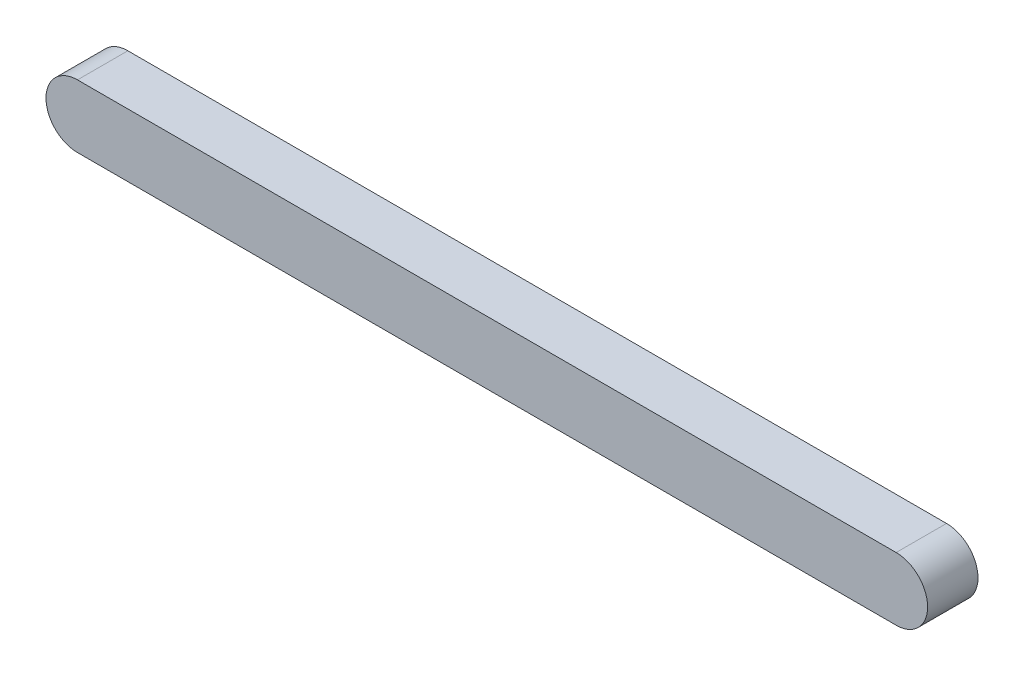
ISO-10303-21;
HEADER;
FILE_DESCRIPTION(('STEP AP214'),'2;1');
FILE_NAME('part.step','',(''),(''),'','','');
FILE_SCHEMA(('AUTOMOTIVE_DESIGN { 1 0 10303 214 1 1 1 1 }'));
ENDSEC;
DATA;
#1=APPLICATION_CONTEXT('core data for automotive mechanical design processes');
#2=APPLICATION_PROTOCOL_DEFINITION('international standard','automotive_design',2000,#1);
#3=PRODUCT_CONTEXT('',#1,'mechanical');
#4=PRODUCT('Part','Part','',(#3));
#5=PRODUCT_RELATED_PRODUCT_CATEGORY('part','',(#4));
#6=PRODUCT_DEFINITION_FORMATION('','',#4);
#7=PRODUCT_DEFINITION_CONTEXT('part definition',#1,'design');
#8=PRODUCT_DEFINITION('design','',#6,#7);
#9=PRODUCT_DEFINITION_SHAPE('','',#8);
#10=(LENGTH_UNIT() NAMED_UNIT(*) SI_UNIT(.MILLI.,.METRE.));
#11=(NAMED_UNIT(*) PLANE_ANGLE_UNIT() SI_UNIT($,.RADIAN.));
#12=(NAMED_UNIT(*) SI_UNIT($,.STERADIAN.) SOLID_ANGLE_UNIT());
#13=UNCERTAINTY_MEASURE_WITH_UNIT(LENGTH_MEASURE(1.E-05),#10,'distance_accuracy_value','');
#14=(GEOMETRIC_REPRESENTATION_CONTEXT(3) GLOBAL_UNCERTAINTY_ASSIGNED_CONTEXT((#13)) GLOBAL_UNIT_ASSIGNED_CONTEXT((#10,
#11,#12)) REPRESENTATION_CONTEXT('',''));
#15=CARTESIAN_POINT('',(0.,0.,0.));
#16=DIRECTION('',(0.,0.,1.));
#17=DIRECTION('',(1.,0.,0.));
#18=AXIS2_PLACEMENT_3D('',#15,#16,#17);
#19=CARTESIAN_POINT('',(-110.432989690722,5.81443298969072,16.));
#20=DIRECTION('',(0.,0.,-1.));
#21=DIRECTION('',(-1.,0.,0.));
#22=AXIS2_PLACEMENT_3D('',#19,#20,#21);
#23=CYLINDRICAL_SURFACE('',#22,10.);
#24=CARTESIAN_POINT('',(-110.432989690722,5.81443298969072,0.));
#25=DIRECTION('',(0.,0.,1.));
#26=DIRECTION('',(1.,0.,0.));
#27=AXIS2_PLACEMENT_3D('',#24,#25,#26);
#28=CIRCLE('',#27,10.);
#29=CARTESIAN_POINT('',(-110.432989690722,15.8144329896907,0.));
#30=VERTEX_POINT('',#29);
#31=CARTESIAN_POINT('',(-110.432989690722,-4.18556701030928,0.));
#32=VERTEX_POINT('',#31);
#33=EDGE_CURVE('E102',#30,#32,#28,.T.);
#34=ORIENTED_EDGE('',*,*,#33,.T.);
#35=DIRECTION('',(0.,0.,-1.));
#36=VECTOR('',#35,1.);
#37=CARTESIAN_POINT('',(-110.432989690722,-4.18556701030928,16.));
#38=LINE('',#37,#36);
#39=CARTESIAN_POINT('',(-110.432989690722,-4.18556701030928,16.));
#40=VERTEX_POINT('',#39);
#41=EDGE_CURVE('E11',#40,#32,#38,.T.);
#42=ORIENTED_EDGE('',*,*,#41,.F.);
#43=CARTESIAN_POINT('',(-110.432989690722,5.81443298969072,16.));
#44=DIRECTION('',(0.,0.,1.));
#45=DIRECTION('',(1.,0.,0.));
#46=AXIS2_PLACEMENT_3D('',#43,#44,#45);
#47=CIRCLE('',#46,10.);
#48=CARTESIAN_POINT('',(-110.432989690722,15.8144329896907,16.));
#49=VERTEX_POINT('',#48);
#50=EDGE_CURVE('E90',#49,#40,#47,.T.);
#51=ORIENTED_EDGE('',*,*,#50,.F.);
#52=DIRECTION('',(0.,0.,-1.));
#53=VECTOR('',#52,1.);
#54=CARTESIAN_POINT('',(-110.432989690722,15.8144329896907,16.));
#55=LINE('',#54,#53);
#56=EDGE_CURVE('E98',#49,#30,#55,.T.);
#57=ORIENTED_EDGE('',*,*,#56,.T.);
#58=EDGE_LOOP('',(#34,#42,#51,#57));
#59=FACE_BOUND('',#58,.T.);
#60=ADVANCED_FACE('F39',(#59),#23,.T.);
#61=CARTESIAN_POINT('',(-110.432989690722,-4.18556701030928,16.));
#62=DIRECTION('',(0.,1.,0.));
#63=DIRECTION('',(0.,0.,1.));
#64=AXIS2_PLACEMENT_3D('',#61,#62,#63);
#65=PLANE('',#64);
#66=DIRECTION('',(1.,0.,0.));
#67=VECTOR('',#66,1.);
#68=CARTESIAN_POINT('',(-110.432989690722,-4.18556701030928,0.));
#69=LINE('',#68,#67);
#70=CARTESIAN_POINT('',(149.567010309278,-4.18556701030928,0.));
#71=VERTEX_POINT('',#70);
#72=EDGE_CURVE('E94',#32,#71,#69,.T.);
#73=ORIENTED_EDGE('',*,*,#72,.T.);
#74=DIRECTION('',(0.,0.,-1.));
#75=VECTOR('',#74,1.);
#76=CARTESIAN_POINT('',(149.567010309278,-4.18556701030928,16.));
#77=LINE('',#76,#75);
#78=CARTESIAN_POINT('',(149.567010309278,-4.18556701030928,16.));
#79=VERTEX_POINT('',#78);
#80=EDGE_CURVE('E47',#79,#71,#77,.T.);
#81=ORIENTED_EDGE('',*,*,#80,.F.);
#82=DIRECTION('',(1.,0.,0.));
#83=VECTOR('',#82,1.);
#84=CARTESIAN_POINT('',(-110.432989690722,-4.18556701030928,16.));
#85=LINE('',#84,#83);
#86=EDGE_CURVE('E85',#40,#79,#85,.T.);
#87=ORIENTED_EDGE('',*,*,#86,.F.);
#88=ORIENTED_EDGE('',*,*,#41,.T.);
#89=EDGE_LOOP('',(#73,#81,#87,#88));
#90=FACE_BOUND('',#89,.T.);
#91=ADVANCED_FACE('F93',(#90),#65,.F.);
#92=CARTESIAN_POINT('',(149.567010309278,5.81443298969072,16.));
#93=DIRECTION('',(0.,0.,-1.));
#94=DIRECTION('',(-1.,0.,0.));
#95=AXIS2_PLACEMENT_3D('',#92,#93,#94);
#96=CYLINDRICAL_SURFACE('',#95,10.);
#97=CARTESIAN_POINT('',(149.567010309278,5.81443298969072,0.));
#98=DIRECTION('',(0.,0.,1.));
#99=DIRECTION('',(-1.,0.,0.));
#100=AXIS2_PLACEMENT_3D('',#97,#98,#99);
#101=CIRCLE('',#100,10.);
#102=CARTESIAN_POINT('',(149.567010309278,15.8144329896907,0.));
#103=VERTEX_POINT('',#102);
#104=EDGE_CURVE('E72',#71,#103,#101,.T.);
#105=ORIENTED_EDGE('',*,*,#104,.T.);
#106=DIRECTION('',(0.,0.,-1.));
#107=VECTOR('',#106,1.);
#108=CARTESIAN_POINT('',(149.567010309278,15.8144329896907,16.));
#109=LINE('',#108,#107);
#110=CARTESIAN_POINT('',(149.567010309278,15.8144329896907,16.));
#111=VERTEX_POINT('',#110);
#112=EDGE_CURVE('E95',#111,#103,#109,.T.);
#113=ORIENTED_EDGE('',*,*,#112,.F.);
#114=CARTESIAN_POINT('',(149.567010309278,5.81443298969072,16.));
#115=DIRECTION('',(0.,0.,1.));
#116=DIRECTION('',(-1.,0.,0.));
#117=AXIS2_PLACEMENT_3D('',#114,#115,#116);
#118=CIRCLE('',#117,10.);
#119=EDGE_CURVE('E88',#79,#111,#118,.T.);
#120=ORIENTED_EDGE('',*,*,#119,.F.);
#121=ORIENTED_EDGE('',*,*,#80,.T.);
#122=EDGE_LOOP('',(#105,#113,#120,#121));
#123=FACE_BOUND('',#122,.T.);
#124=ADVANCED_FACE('F96',(#123),#96,.T.);
#125=CARTESIAN_POINT('',(-110.432989690722,15.8144329896907,16.));
#126=DIRECTION('',(0.,-1.,0.));
#127=DIRECTION('',(0.,0.,-1.));
#128=AXIS2_PLACEMENT_3D('',#125,#126,#127);
#129=PLANE('',#128);
#130=DIRECTION('',(-1.,0.,0.));
#131=VECTOR('',#130,1.);
#132=CARTESIAN_POINT('',(-110.432989690722,15.8144329896907,0.));
#133=LINE('',#132,#131);
#134=EDGE_CURVE('E78',#103,#30,#133,.T.);
#135=ORIENTED_EDGE('',*,*,#134,.T.);
#136=ORIENTED_EDGE('',*,*,#56,.F.);
#137=DIRECTION('',(-1.,0.,0.));
#138=VECTOR('',#137,1.);
#139=CARTESIAN_POINT('',(-110.432989690722,15.8144329896907,16.));
#140=LINE('',#139,#138);
#141=EDGE_CURVE('E55',#111,#49,#140,.T.);
#142=ORIENTED_EDGE('',*,*,#141,.F.);
#143=ORIENTED_EDGE('',*,*,#112,.T.);
#144=EDGE_LOOP('',(#135,#136,#142,#143));
#145=FACE_BOUND('',#144,.T.);
#146=ADVANCED_FACE('F109',(#145),#129,.F.);
#147=CARTESIAN_POINT('',(-110.432989690722,5.81443298969072,16.));
#148=DIRECTION('',(0.,0.,1.));
#149=DIRECTION('',(1.,0.,0.));
#150=AXIS2_PLACEMENT_3D('',#147,#148,#149);
#151=PLANE('',#150);
#152=ORIENTED_EDGE('',*,*,#50,.T.);
#153=ORIENTED_EDGE('',*,*,#86,.T.);
#154=ORIENTED_EDGE('',*,*,#119,.T.);
#155=ORIENTED_EDGE('',*,*,#141,.T.);
#156=EDGE_LOOP('',(#152,#153,#154,#155));
#157=FACE_BOUND('',#156,.T.);
#158=ADVANCED_FACE('F86',(#157),#151,.T.);
#159=CARTESIAN_POINT('',(-110.432989690722,5.81443298969072,0.));
#160=DIRECTION('',(0.,0.,1.));
#161=DIRECTION('',(1.,0.,0.));
#162=AXIS2_PLACEMENT_3D('',#159,#160,#161);
#163=PLANE('',#162);
#164=ORIENTED_EDGE('',*,*,#33,.F.);
#165=ORIENTED_EDGE('',*,*,#134,.F.);
#166=ORIENTED_EDGE('',*,*,#104,.F.);
#167=ORIENTED_EDGE('',*,*,#72,.F.);
#168=EDGE_LOOP('',(#164,#165,#166,#167));
#169=FACE_BOUND('',#168,.T.);
#170=ADVANCED_FACE('F112',(#169),#163,.F.);
#171=CLOSED_SHELL('',(#60,#91,#124,#146,#158,#170));
#172=MANIFOLD_SOLID_BREP('B2',#171);
#173=ADVANCED_BREP_SHAPE_REPRESENTATION('',(#18,#172),#14);
#174=SHAPE_DEFINITION_REPRESENTATION(#9,#173);
ENDSEC;
END-ISO-10303-21;
